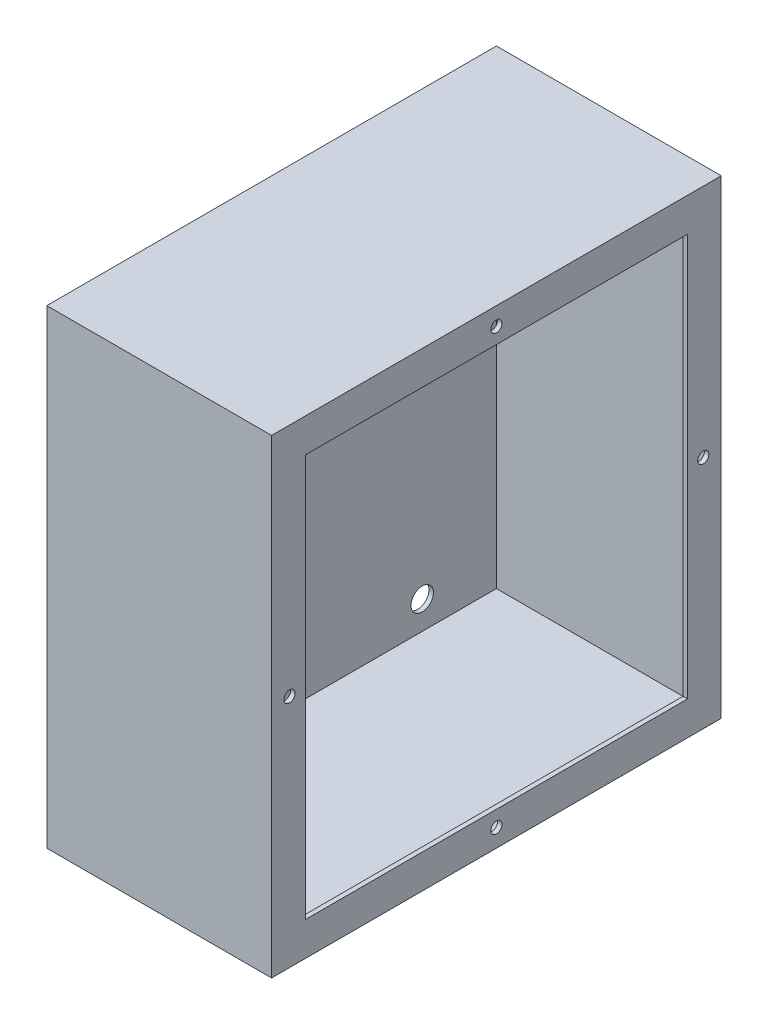
ISO-10303-21;
HEADER;
FILE_DESCRIPTION(('STEP AP214'),'2;1');
FILE_NAME('part.step','',(''),(''),'','','');
FILE_SCHEMA(('AUTOMOTIVE_DESIGN { 1 0 10303 214 1 1 1 1 }'));
ENDSEC;
DATA;
#1=APPLICATION_CONTEXT('core data for automotive mechanical design processes');
#2=APPLICATION_PROTOCOL_DEFINITION('international standard','automotive_design',2000,#1);
#3=PRODUCT_CONTEXT('',#1,'mechanical');
#4=PRODUCT('Part','Part','',(#3));
#5=PRODUCT_RELATED_PRODUCT_CATEGORY('part','',(#4));
#6=PRODUCT_DEFINITION_FORMATION('','',#4);
#7=PRODUCT_DEFINITION_CONTEXT('part definition',#1,'design');
#8=PRODUCT_DEFINITION('design','',#6,#7);
#9=PRODUCT_DEFINITION_SHAPE('','',#8);
#10=(LENGTH_UNIT() NAMED_UNIT(*) SI_UNIT(.MILLI.,.METRE.));
#11=(NAMED_UNIT(*) PLANE_ANGLE_UNIT() SI_UNIT($,.RADIAN.));
#12=(NAMED_UNIT(*) SI_UNIT($,.STERADIAN.) SOLID_ANGLE_UNIT());
#13=UNCERTAINTY_MEASURE_WITH_UNIT(LENGTH_MEASURE(1.E-05),#10,'distance_accuracy_value','');
#14=(GEOMETRIC_REPRESENTATION_CONTEXT(3) GLOBAL_UNCERTAINTY_ASSIGNED_CONTEXT((#13)) GLOBAL_UNIT_ASSIGNED_CONTEXT((#10,
#11,#12)) REPRESENTATION_CONTEXT('',''));
#15=CARTESIAN_POINT('',(0.,0.,0.));
#16=DIRECTION('',(0.,0.,1.));
#17=DIRECTION('',(1.,0.,0.));
#18=AXIS2_PLACEMENT_3D('',#15,#16,#17);
#19=CARTESIAN_POINT('',(100.,104.5,-100.));
#20=DIRECTION('',(0.,0.,1.));
#21=DIRECTION('',(0.,-1.,0.));
#22=AXIS2_PLACEMENT_3D('',#19,#20,#21);
#23=PLANE('',#22);
#24=DIRECTION('',(0.,1.,0.));
#25=VECTOR('',#24,1.);
#26=CARTESIAN_POINT('',(0.,104.5,-100.));
#27=LINE('',#26,#25);
#28=CARTESIAN_POINT('',(0.,-104.5,-100.));
#29=VERTEX_POINT('',#28);
#30=CARTESIAN_POINT('',(0.,104.5,-100.));
#31=VERTEX_POINT('',#30);
#32=EDGE_CURVE('E162',#29,#31,#27,.T.);
#33=ORIENTED_EDGE('',*,*,#32,.T.);
#34=DIRECTION('',(-1.,0.,0.));
#35=VECTOR('',#34,1.);
#36=CARTESIAN_POINT('',(100.,104.5,-100.));
#37=LINE('',#36,#35);
#38=CARTESIAN_POINT('',(100.,104.5,-100.));
#39=VERTEX_POINT('',#38);
#40=EDGE_CURVE('E178',#39,#31,#37,.T.);
#41=ORIENTED_EDGE('',*,*,#40,.F.);
#42=DIRECTION('',(0.,1.,0.));
#43=VECTOR('',#42,1.);
#44=CARTESIAN_POINT('',(100.,104.5,-100.));
#45=LINE('',#44,#43);
#46=CARTESIAN_POINT('',(100.,-104.5,-100.));
#47=VERTEX_POINT('',#46);
#48=EDGE_CURVE('E151',#47,#39,#45,.T.);
#49=ORIENTED_EDGE('',*,*,#48,.F.);
#50=DIRECTION('',(-1.,0.,0.));
#51=VECTOR('',#50,1.);
#52=CARTESIAN_POINT('',(100.,-104.5,-100.));
#53=LINE('',#52,#51);
#54=EDGE_CURVE('E161',#47,#29,#53,.T.);
#55=ORIENTED_EDGE('',*,*,#54,.T.);
#56=EDGE_LOOP('',(#33,#41,#49,#55));
#57=FACE_BOUND('',#56,.T.);
#58=ADVANCED_FACE('F35',(#57),#23,.F.);
#59=CARTESIAN_POINT('',(100.,104.5,100.));
#60=DIRECTION('',(0.,-1.,0.));
#61=DIRECTION('',(0.,0.,-1.));
#62=AXIS2_PLACEMENT_3D('',#59,#60,#61);
#63=PLANE('',#62);
#64=DIRECTION('',(0.,0.,1.));
#65=VECTOR('',#64,1.);
#66=CARTESIAN_POINT('',(0.,104.5,100.));
#67=LINE('',#66,#65);
#68=CARTESIAN_POINT('',(0.,104.5,100.));
#69=VERTEX_POINT('',#68);
#70=EDGE_CURVE('E165',#31,#69,#67,.T.);
#71=ORIENTED_EDGE('',*,*,#70,.T.);
#72=DIRECTION('',(-1.,0.,0.));
#73=VECTOR('',#72,1.);
#74=CARTESIAN_POINT('',(100.,104.5,100.));
#75=LINE('',#74,#73);
#76=CARTESIAN_POINT('',(100.,104.5,100.));
#77=VERTEX_POINT('',#76);
#78=EDGE_CURVE('E175',#77,#69,#75,.T.);
#79=ORIENTED_EDGE('',*,*,#78,.F.);
#80=DIRECTION('',(0.,0.,1.));
#81=VECTOR('',#80,1.);
#82=CARTESIAN_POINT('',(100.,104.5,100.));
#83=LINE('',#82,#81);
#84=EDGE_CURVE('E154',#39,#77,#83,.T.);
#85=ORIENTED_EDGE('',*,*,#84,.F.);
#86=ORIENTED_EDGE('',*,*,#40,.T.);
#87=EDGE_LOOP('',(#71,#79,#85,#86));
#88=FACE_BOUND('',#87,.T.);
#89=ADVANCED_FACE('F233',(#88),#63,.F.);
#90=CARTESIAN_POINT('',(100.,104.5,100.));
#91=DIRECTION('',(0.,0.,-1.));
#92=DIRECTION('',(0.,1.,0.));
#93=AXIS2_PLACEMENT_3D('',#90,#91,#92);
#94=PLANE('',#93);
#95=DIRECTION('',(0.,-1.,0.));
#96=VECTOR('',#95,1.);
#97=CARTESIAN_POINT('',(0.,104.5,100.));
#98=LINE('',#97,#96);
#99=CARTESIAN_POINT('',(0.,-104.5,100.));
#100=VERTEX_POINT('',#99);
#101=EDGE_CURVE('E167',#69,#100,#98,.T.);
#102=ORIENTED_EDGE('',*,*,#101,.T.);
#103=DIRECTION('',(-1.,0.,0.));
#104=VECTOR('',#103,1.);
#105=CARTESIAN_POINT('',(100.,-104.5,100.));
#106=LINE('',#105,#104);
#107=CARTESIAN_POINT('',(100.,-104.5,100.));
#108=VERTEX_POINT('',#107);
#109=EDGE_CURVE('E172',#108,#100,#106,.T.);
#110=ORIENTED_EDGE('',*,*,#109,.F.);
#111=DIRECTION('',(0.,-1.,0.));
#112=VECTOR('',#111,1.);
#113=CARTESIAN_POINT('',(100.,104.5,100.));
#114=LINE('',#113,#112);
#115=EDGE_CURVE('E157',#77,#108,#114,.T.);
#116=ORIENTED_EDGE('',*,*,#115,.F.);
#117=ORIENTED_EDGE('',*,*,#78,.T.);
#118=EDGE_LOOP('',(#102,#110,#116,#117));
#119=FACE_BOUND('',#118,.T.);
#120=ADVANCED_FACE('F239',(#119),#94,.F.);
#121=CARTESIAN_POINT('',(100.,-104.5,100.));
#122=DIRECTION('',(0.,1.,0.));
#123=DIRECTION('',(0.,0.,1.));
#124=AXIS2_PLACEMENT_3D('',#121,#122,#123);
#125=PLANE('',#124);
#126=DIRECTION('',(0.,0.,-1.));
#127=VECTOR('',#126,1.);
#128=CARTESIAN_POINT('',(0.,-104.5,100.));
#129=LINE('',#128,#127);
#130=EDGE_CURVE('E155',#100,#29,#129,.T.);
#131=ORIENTED_EDGE('',*,*,#130,.T.);
#132=ORIENTED_EDGE('',*,*,#54,.F.);
#133=DIRECTION('',(0.,0.,-1.));
#134=VECTOR('',#133,1.);
#135=CARTESIAN_POINT('',(100.,-104.5,100.));
#136=LINE('',#135,#134);
#137=EDGE_CURVE('E159',#108,#47,#136,.T.);
#138=ORIENTED_EDGE('',*,*,#137,.F.);
#139=ORIENTED_EDGE('',*,*,#109,.T.);
#140=EDGE_LOOP('',(#131,#132,#138,#139));
#141=FACE_BOUND('',#140,.T.);
#142=ADVANCED_FACE('F311',(#141),#125,.F.);
#143=CARTESIAN_POINT('',(100.,0.,0.));
#144=DIRECTION('',(1.,0.,0.));
#145=DIRECTION('',(0.,0.,-1.));
#146=AXIS2_PLACEMENT_3D('',#143,#144,#145);
#147=PLANE('',#146);
#148=CARTESIAN_POINT('',(100.,96.5,0.));
#149=DIRECTION('',(1.,0.,0.));
#150=DIRECTION('',(0.,0.,-1.));
#151=AXIS2_PLACEMENT_3D('',#148,#149,#150);
#152=CIRCLE('',#151,2.5);
#153=CARTESIAN_POINT('',(100.,96.5,-2.5));
#154=VERTEX_POINT('',#153);
#155=EDGE_CURVE('E485',#154,#154,#152,.T.);
#156=ORIENTED_EDGE('',*,*,#155,.F.);
#157=EDGE_LOOP('',(#156));
#158=FACE_BOUND('',#157,.T.);
#159=CARTESIAN_POINT('',(100.,0.,92.));
#160=DIRECTION('',(1.,0.,0.));
#161=DIRECTION('',(0.,0.,-1.));
#162=AXIS2_PLACEMENT_3D('',#159,#160,#161);
#163=CIRCLE('',#162,2.49999999999999);
#164=CARTESIAN_POINT('',(100.,0.,89.5));
#165=VERTEX_POINT('',#164);
#166=EDGE_CURVE('E492',#165,#165,#163,.T.);
#167=ORIENTED_EDGE('',*,*,#166,.F.);
#168=EDGE_LOOP('',(#167));
#169=FACE_BOUND('',#168,.T.);
#170=CARTESIAN_POINT('',(100.,-96.5,0.));
#171=DIRECTION('',(1.,0.,0.));
#172=DIRECTION('',(0.,0.,1.));
#173=AXIS2_PLACEMENT_3D('',#170,#171,#172);
#174=CIRCLE('',#173,2.5);
#175=CARTESIAN_POINT('',(100.,-96.5,2.5));
#176=VERTEX_POINT('',#175);
#177=EDGE_CURVE('E498',#176,#176,#174,.T.);
#178=ORIENTED_EDGE('',*,*,#177,.F.);
#179=EDGE_LOOP('',(#178));
#180=FACE_BOUND('',#179,.T.);
#181=CARTESIAN_POINT('',(100.,0.,-92.));
#182=DIRECTION('',(1.,0.,0.));
#183=DIRECTION('',(0.,0.,1.));
#184=AXIS2_PLACEMENT_3D('',#181,#182,#183);
#185=CIRCLE('',#184,2.49999999999999);
#186=CARTESIAN_POINT('',(100.,0.,-89.5));
#187=VERTEX_POINT('',#186);
#188=EDGE_CURVE('E483',#187,#187,#185,.T.);
#189=ORIENTED_EDGE('',*,*,#188,.F.);
#190=EDGE_LOOP('',(#189));
#191=FACE_BOUND('',#190,.T.);
#192=DIRECTION('',(0.,1.,0.));
#193=VECTOR('',#192,1.);
#194=CARTESIAN_POINT('',(100.,89.5,-85.));
#195=LINE('',#194,#193);
#196=CARTESIAN_POINT('',(100.,-89.5,-85.));
#197=VERTEX_POINT('',#196);
#198=CARTESIAN_POINT('',(100.,89.5,-85.));
#199=VERTEX_POINT('',#198);
#200=EDGE_CURVE('E60',#197,#199,#195,.T.);
#201=ORIENTED_EDGE('',*,*,#200,.F.);
#202=DIRECTION('',(0.,0.,-1.));
#203=VECTOR('',#202,1.);
#204=CARTESIAN_POINT('',(100.,-89.5,85.));
#205=LINE('',#204,#203);
#206=CARTESIAN_POINT('',(100.,-89.5,85.));
#207=VERTEX_POINT('',#206);
#208=EDGE_CURVE('E127',#207,#197,#205,.T.);
#209=ORIENTED_EDGE('',*,*,#208,.F.);
#210=DIRECTION('',(0.,-1.,0.));
#211=VECTOR('',#210,1.);
#212=CARTESIAN_POINT('',(100.,89.5,85.));
#213=LINE('',#212,#211);
#214=CARTESIAN_POINT('',(100.,89.5,85.));
#215=VERTEX_POINT('',#214);
#216=EDGE_CURVE('E510',#215,#207,#213,.T.);
#217=ORIENTED_EDGE('',*,*,#216,.F.);
#218=DIRECTION('',(0.,0.,1.));
#219=VECTOR('',#218,1.);
#220=CARTESIAN_POINT('',(100.,89.5,85.));
#221=LINE('',#220,#219);
#222=EDGE_CURVE('E513',#199,#215,#221,.T.);
#223=ORIENTED_EDGE('',*,*,#222,.F.);
#224=EDGE_LOOP('',(#201,#209,#217,#223));
#225=FACE_BOUND('',#224,.T.);
#226=ORIENTED_EDGE('',*,*,#48,.T.);
#227=ORIENTED_EDGE('',*,*,#84,.T.);
#228=ORIENTED_EDGE('',*,*,#115,.T.);
#229=ORIENTED_EDGE('',*,*,#137,.T.);
#230=EDGE_LOOP('',(#226,#227,#228,#229));
#231=FACE_BOUND('',#230,.T.);
#232=ADVANCED_FACE('F306',(#158,#169,#180,#191,#225,#231),#147,.T.);
#233=CARTESIAN_POINT('',(0.,0.,0.));
#234=DIRECTION('',(1.,0.,0.));
#235=DIRECTION('',(0.,0.,-1.));
#236=AXIS2_PLACEMENT_3D('',#233,#234,#235);
#237=PLANE('',#236);
#238=CARTESIAN_POINT('',(0.,90.,65.));
#239=DIRECTION('',(-1.,0.,0.));
#240=DIRECTION('',(0.,0.,-1.));
#241=AXIS2_PLACEMENT_3D('',#238,#239,#240);
#242=CIRCLE('',#241,5.);
#243=CARTESIAN_POINT('',(0.,90.,60.));
#244=VERTEX_POINT('',#243);
#245=EDGE_CURVE('E464',#244,#244,#242,.T.);
#246=ORIENTED_EDGE('',*,*,#245,.F.);
#247=EDGE_LOOP('',(#246));
#248=FACE_BOUND('',#247,.T.);
#249=CARTESIAN_POINT('',(0.,-90.0000000000001,-64.9999999999999));
#250=DIRECTION('',(-1.,0.,0.));
#251=DIRECTION('',(0.,0.,-1.));
#252=AXIS2_PLACEMENT_3D('',#249,#250,#251);
#253=CIRCLE('',#252,4.99999999999999);
#254=CARTESIAN_POINT('',(0.,-90.0000000000001,-69.9999999999999));
#255=VERTEX_POINT('',#254);
#256=EDGE_CURVE('E470',#255,#255,#253,.T.);
#257=ORIENTED_EDGE('',*,*,#256,.F.);
#258=EDGE_LOOP('',(#257));
#259=FACE_BOUND('',#258,.T.);
#260=CARTESIAN_POINT('',(0.,-89.9999999999999,65.0000000000001));
#261=DIRECTION('',(-1.,0.,0.));
#262=DIRECTION('',(0.,0.,1.));
#263=AXIS2_PLACEMENT_3D('',#260,#261,#262);
#264=CIRCLE('',#263,5.00000000000001);
#265=CARTESIAN_POINT('',(0.,-89.9999999999999,70.0000000000001));
#266=VERTEX_POINT('',#265);
#267=EDGE_CURVE('E481',#266,#266,#264,.T.);
#268=ORIENTED_EDGE('',*,*,#267,.F.);
#269=EDGE_LOOP('',(#268));
#270=FACE_BOUND('',#269,.T.);
#271=CARTESIAN_POINT('',(0.,90.,-65.));
#272=DIRECTION('',(-1.,0.,0.));
#273=DIRECTION('',(0.,0.,1.));
#274=AXIS2_PLACEMENT_3D('',#271,#272,#273);
#275=CIRCLE('',#274,5.);
#276=CARTESIAN_POINT('',(0.,90.,-60.));
#277=VERTEX_POINT('',#276);
#278=EDGE_CURVE('E468',#277,#277,#275,.T.);
#279=ORIENTED_EDGE('',*,*,#278,.F.);
#280=EDGE_LOOP('',(#279));
#281=FACE_BOUND('',#280,.T.);
#282=ORIENTED_EDGE('',*,*,#32,.F.);
#283=ORIENTED_EDGE('',*,*,#130,.F.);
#284=ORIENTED_EDGE('',*,*,#101,.F.);
#285=ORIENTED_EDGE('',*,*,#70,.F.);
#286=EDGE_LOOP('',(#282,#283,#284,#285));
#287=FACE_BOUND('',#286,.T.);
#288=ADVANCED_FACE('F270',(#248,#259,#270,#281,#287),#237,.F.);
#289=CARTESIAN_POINT('',(-0.001000000000001,89.5,-85.));
#290=DIRECTION('',(0.,0.,-1.));
#291=DIRECTION('',(0.,1.,0.));
#292=AXIS2_PLACEMENT_3D('',#289,#290,#291);
#293=PLANE('',#292);
#294=DIRECTION('',(0.,-1.,0.));
#295=VECTOR('',#294,1.);
#296=CARTESIAN_POINT('',(98.,89.5,-85.));
#297=LINE('',#296,#295);
#298=CARTESIAN_POINT('',(98.,89.5,-85.));
#299=VERTEX_POINT('',#298);
#300=CARTESIAN_POINT('',(98.,-89.5,-85.));
#301=VERTEX_POINT('',#300);
#302=EDGE_CURVE('E132',#299,#301,#297,.T.);
#303=ORIENTED_EDGE('',*,*,#302,.T.);
#304=DIRECTION('',(1.,0.,0.));
#305=VECTOR('',#304,1.);
#306=CARTESIAN_POINT('',(-0.001000000000001,-89.5,-85.));
#307=LINE('',#306,#305);
#308=EDGE_CURVE('E123',#301,#197,#307,.T.);
#309=ORIENTED_EDGE('',*,*,#308,.T.);
#310=ORIENTED_EDGE('',*,*,#200,.T.);
#311=DIRECTION('',(1.,0.,0.));
#312=VECTOR('',#311,1.);
#313=CARTESIAN_POINT('',(-0.001000000000001,89.5,-85.));
#314=LINE('',#313,#312);
#315=EDGE_CURVE('E129',#299,#199,#314,.T.);
#316=ORIENTED_EDGE('',*,*,#315,.F.);
#317=EDGE_LOOP('',(#303,#309,#310,#316));
#318=FACE_BOUND('',#317,.T.);
#319=ADVANCED_FACE('F133',(#318),#293,.F.);
#320=CARTESIAN_POINT('',(-0.001000000000001,-89.5,85.));
#321=DIRECTION('',(0.,-1.,0.));
#322=DIRECTION('',(0.,0.,-1.));
#323=AXIS2_PLACEMENT_3D('',#320,#321,#322);
#324=PLANE('',#323);
#325=DIRECTION('',(0.,0.,1.));
#326=VECTOR('',#325,1.);
#327=CARTESIAN_POINT('',(98.,-89.5,85.));
#328=LINE('',#327,#326);
#329=CARTESIAN_POINT('',(98.,-89.5,85.));
#330=VERTEX_POINT('',#329);
#331=EDGE_CURVE('E52',#301,#330,#328,.T.);
#332=ORIENTED_EDGE('',*,*,#331,.T.);
#333=DIRECTION('',(1.,0.,0.));
#334=VECTOR('',#333,1.);
#335=CARTESIAN_POINT('',(-0.001000000000001,-89.5,85.));
#336=LINE('',#335,#334);
#337=EDGE_CURVE('E128',#330,#207,#336,.T.);
#338=ORIENTED_EDGE('',*,*,#337,.T.);
#339=ORIENTED_EDGE('',*,*,#208,.T.);
#340=ORIENTED_EDGE('',*,*,#308,.F.);
#341=EDGE_LOOP('',(#332,#338,#339,#340));
#342=FACE_BOUND('',#341,.T.);
#343=ADVANCED_FACE('F125',(#342),#324,.F.);
#344=CARTESIAN_POINT('',(-0.001000000000001,89.5,85.));
#345=DIRECTION('',(0.,0.,1.));
#346=DIRECTION('',(0.,-1.,0.));
#347=AXIS2_PLACEMENT_3D('',#344,#345,#346);
#348=PLANE('',#347);
#349=DIRECTION('',(0.,1.,0.));
#350=VECTOR('',#349,1.);
#351=CARTESIAN_POINT('',(98.,89.5,85.));
#352=LINE('',#351,#350);
#353=CARTESIAN_POINT('',(98.,89.5,85.));
#354=VERTEX_POINT('',#353);
#355=EDGE_CURVE('E142',#330,#354,#352,.T.);
#356=ORIENTED_EDGE('',*,*,#355,.T.);
#357=DIRECTION('',(1.,0.,0.));
#358=VECTOR('',#357,1.);
#359=CARTESIAN_POINT('',(-0.001000000000001,89.5,85.));
#360=LINE('',#359,#358);
#361=EDGE_CURVE('E148',#354,#215,#360,.T.);
#362=ORIENTED_EDGE('',*,*,#361,.T.);
#363=ORIENTED_EDGE('',*,*,#216,.T.);
#364=ORIENTED_EDGE('',*,*,#337,.F.);
#365=EDGE_LOOP('',(#356,#362,#363,#364));
#366=FACE_BOUND('',#365,.T.);
#367=ADVANCED_FACE('F281',(#366),#348,.F.);
#368=CARTESIAN_POINT('',(-0.001000000000001,89.5,85.));
#369=DIRECTION('',(0.,1.,0.));
#370=DIRECTION('',(0.,0.,1.));
#371=AXIS2_PLACEMENT_3D('',#368,#369,#370);
#372=PLANE('',#371);
#373=DIRECTION('',(0.,0.,-1.));
#374=VECTOR('',#373,1.);
#375=CARTESIAN_POINT('',(98.,89.5,85.));
#376=LINE('',#375,#374);
#377=EDGE_CURVE('E137',#354,#299,#376,.T.);
#378=ORIENTED_EDGE('',*,*,#377,.T.);
#379=ORIENTED_EDGE('',*,*,#315,.T.);
#380=ORIENTED_EDGE('',*,*,#222,.T.);
#381=ORIENTED_EDGE('',*,*,#361,.F.);
#382=EDGE_LOOP('',(#378,#379,#380,#381));
#383=FACE_BOUND('',#382,.T.);
#384=ADVANCED_FACE('F290',(#383),#372,.F.);
#385=CARTESIAN_POINT('',(98.,0.,0.));
#386=DIRECTION('',(1.,0.,0.));
#387=DIRECTION('',(0.,0.,-1.));
#388=AXIS2_PLACEMENT_3D('',#385,#386,#387);
#389=PLANE('',#388);
#390=CARTESIAN_POINT('',(98.,96.5,0.));
#391=DIRECTION('',(1.,0.,0.));
#392=DIRECTION('',(0.,0.,-1.));
#393=AXIS2_PLACEMENT_3D('',#390,#391,#392);
#394=CIRCLE('',#393,2.5);
#395=CARTESIAN_POINT('',(98.,96.5,-2.5));
#396=VERTEX_POINT('',#395);
#397=EDGE_CURVE('E488',#396,#396,#394,.F.);
#398=ORIENTED_EDGE('',*,*,#397,.F.);
#399=EDGE_LOOP('',(#398));
#400=FACE_BOUND('',#399,.T.);
#401=CARTESIAN_POINT('',(98.,0.,92.));
#402=DIRECTION('',(1.,0.,0.));
#403=DIRECTION('',(0.,0.,-1.));
#404=AXIS2_PLACEMENT_3D('',#401,#402,#403);
#405=CIRCLE('',#404,2.49999999999999);
#406=CARTESIAN_POINT('',(98.,0.,89.5));
#407=VERTEX_POINT('',#406);
#408=EDGE_CURVE('E489',#407,#407,#405,.F.);
#409=ORIENTED_EDGE('',*,*,#408,.F.);
#410=EDGE_LOOP('',(#409));
#411=FACE_BOUND('',#410,.T.);
#412=CARTESIAN_POINT('',(98.,-96.5,0.));
#413=DIRECTION('',(1.,0.,0.));
#414=DIRECTION('',(0.,0.,-1.));
#415=AXIS2_PLACEMENT_3D('',#412,#413,#414);
#416=CIRCLE('',#415,2.5);
#417=CARTESIAN_POINT('',(98.,-96.5,-2.5));
#418=VERTEX_POINT('',#417);
#419=EDGE_CURVE('E495',#418,#418,#416,.F.);
#420=ORIENTED_EDGE('',*,*,#419,.F.);
#421=EDGE_LOOP('',(#420));
#422=FACE_BOUND('',#421,.T.);
#423=CARTESIAN_POINT('',(98.,0.,-92.));
#424=DIRECTION('',(1.,0.,0.));
#425=DIRECTION('',(0.,0.,-1.));
#426=AXIS2_PLACEMENT_3D('',#423,#424,#425);
#427=CIRCLE('',#426,2.49999999999999);
#428=CARTESIAN_POINT('',(98.,0.,-94.5));
#429=VERTEX_POINT('',#428);
#430=EDGE_CURVE('E501',#429,#429,#427,.F.);
#431=ORIENTED_EDGE('',*,*,#430,.F.);
#432=EDGE_LOOP('',(#431));
#433=FACE_BOUND('',#432,.T.);
#434=DIRECTION('',(0.,1.,0.));
#435=VECTOR('',#434,1.);
#436=CARTESIAN_POINT('',(98.,104.5,-98.));
#437=LINE('',#436,#435);
#438=CARTESIAN_POINT('',(98.,-102.5,-98.));
#439=VERTEX_POINT('',#438);
#440=CARTESIAN_POINT('',(98.,102.5,-98.));
#441=VERTEX_POINT('',#440);
#442=EDGE_CURVE('E184',#439,#441,#437,.T.);
#443=ORIENTED_EDGE('',*,*,#442,.F.);
#444=DIRECTION('',(0.,0.,-1.));
#445=VECTOR('',#444,1.);
#446=CARTESIAN_POINT('',(98.,-102.5,100.));
#447=LINE('',#446,#445);
#448=CARTESIAN_POINT('',(98.,-102.5,98.));
#449=VERTEX_POINT('',#448);
#450=EDGE_CURVE('E11',#449,#439,#447,.T.);
#451=ORIENTED_EDGE('',*,*,#450,.F.);
#452=DIRECTION('',(0.,-1.,0.));
#453=VECTOR('',#452,1.);
#454=CARTESIAN_POINT('',(98.,104.5,98.));
#455=LINE('',#454,#453);
#456=CARTESIAN_POINT('',(98.,102.5,98.));
#457=VERTEX_POINT('',#456);
#458=EDGE_CURVE('E44',#457,#449,#455,.T.);
#459=ORIENTED_EDGE('',*,*,#458,.F.);
#460=DIRECTION('',(0.,0.,1.));
#461=VECTOR('',#460,1.);
#462=CARTESIAN_POINT('',(98.,102.5,100.));
#463=LINE('',#462,#461);
#464=EDGE_CURVE('E182',#441,#457,#463,.T.);
#465=ORIENTED_EDGE('',*,*,#464,.F.);
#466=EDGE_LOOP('',(#443,#451,#459,#465));
#467=FACE_BOUND('',#466,.T.);
#468=ORIENTED_EDGE('',*,*,#377,.F.);
#469=ORIENTED_EDGE('',*,*,#355,.F.);
#470=ORIENTED_EDGE('',*,*,#331,.F.);
#471=ORIENTED_EDGE('',*,*,#302,.F.);
#472=EDGE_LOOP('',(#468,#469,#470,#471));
#473=FACE_BOUND('',#472,.T.);
#474=ADVANCED_FACE('F140',(#400,#411,#422,#433,#467,#473),#389,.F.);
#475=CARTESIAN_POINT('',(100.,104.5,-98.));
#476=DIRECTION('',(0.,0.,1.));
#477=DIRECTION('',(0.,-1.,0.));
#478=AXIS2_PLACEMENT_3D('',#475,#476,#477);
#479=PLANE('',#478);
#480=DIRECTION('',(0.,1.,0.));
#481=VECTOR('',#480,1.);
#482=CARTESIAN_POINT('',(2.,104.5,-98.));
#483=LINE('',#482,#481);
#484=CARTESIAN_POINT('',(2.,-102.5,-98.));
#485=VERTEX_POINT('',#484);
#486=CARTESIAN_POINT('',(2.,102.5,-98.));
#487=VERTEX_POINT('',#486);
#488=EDGE_CURVE('E39',#485,#487,#483,.T.);
#489=ORIENTED_EDGE('',*,*,#488,.F.);
#490=DIRECTION('',(-1.,0.,0.));
#491=VECTOR('',#490,1.);
#492=CARTESIAN_POINT('',(100.,-102.5,-98.));
#493=LINE('',#492,#491);
#494=EDGE_CURVE('E201',#439,#485,#493,.T.);
#495=ORIENTED_EDGE('',*,*,#494,.F.);
#496=ORIENTED_EDGE('',*,*,#442,.T.);
#497=DIRECTION('',(-1.,0.,0.));
#498=VECTOR('',#497,1.);
#499=CARTESIAN_POINT('',(100.,102.5,-98.));
#500=LINE('',#499,#498);
#501=EDGE_CURVE('E197',#441,#487,#500,.T.);
#502=ORIENTED_EDGE('',*,*,#501,.T.);
#503=EDGE_LOOP('',(#489,#495,#496,#502));
#504=FACE_BOUND('',#503,.T.);
#505=ADVANCED_FACE('F210',(#504),#479,.T.);
#506=CARTESIAN_POINT('',(100.,102.5,100.));
#507=DIRECTION('',(0.,-1.,0.));
#508=DIRECTION('',(0.,0.,-1.));
#509=AXIS2_PLACEMENT_3D('',#506,#507,#508);
#510=PLANE('',#509);
#511=DIRECTION('',(0.,0.,1.));
#512=VECTOR('',#511,1.);
#513=CARTESIAN_POINT('',(2.,102.5,100.));
#514=LINE('',#513,#512);
#515=CARTESIAN_POINT('',(2.,102.5,98.));
#516=VERTEX_POINT('',#515);
#517=EDGE_CURVE('E200',#487,#516,#514,.T.);
#518=ORIENTED_EDGE('',*,*,#517,.F.);
#519=ORIENTED_EDGE('',*,*,#501,.F.);
#520=ORIENTED_EDGE('',*,*,#464,.T.);
#521=DIRECTION('',(-1.,0.,0.));
#522=VECTOR('',#521,1.);
#523=CARTESIAN_POINT('',(100.,102.5,98.));
#524=LINE('',#523,#522);
#525=EDGE_CURVE('E192',#457,#516,#524,.T.);
#526=ORIENTED_EDGE('',*,*,#525,.T.);
#527=EDGE_LOOP('',(#518,#519,#520,#526));
#528=FACE_BOUND('',#527,.T.);
#529=ADVANCED_FACE('F214',(#528),#510,.T.);
#530=CARTESIAN_POINT('',(100.,104.5,98.));
#531=DIRECTION('',(0.,0.,-1.));
#532=DIRECTION('',(0.,1.,0.));
#533=AXIS2_PLACEMENT_3D('',#530,#531,#532);
#534=PLANE('',#533);
#535=DIRECTION('',(0.,-1.,0.));
#536=VECTOR('',#535,1.);
#537=CARTESIAN_POINT('',(2.,104.5,98.));
#538=LINE('',#537,#536);
#539=CARTESIAN_POINT('',(2.,-102.5,98.));
#540=VERTEX_POINT('',#539);
#541=EDGE_CURVE('E195',#516,#540,#538,.T.);
#542=ORIENTED_EDGE('',*,*,#541,.F.);
#543=ORIENTED_EDGE('',*,*,#525,.F.);
#544=ORIENTED_EDGE('',*,*,#458,.T.);
#545=DIRECTION('',(-1.,0.,0.));
#546=VECTOR('',#545,1.);
#547=CARTESIAN_POINT('',(100.,-102.5,98.));
#548=LINE('',#547,#546);
#549=EDGE_CURVE('E187',#449,#540,#548,.T.);
#550=ORIENTED_EDGE('',*,*,#549,.T.);
#551=EDGE_LOOP('',(#542,#543,#544,#550));
#552=FACE_BOUND('',#551,.T.);
#553=ADVANCED_FACE('F219',(#552),#534,.T.);
#554=CARTESIAN_POINT('',(100.,-102.5,100.));
#555=DIRECTION('',(0.,1.,0.));
#556=DIRECTION('',(0.,0.,1.));
#557=AXIS2_PLACEMENT_3D('',#554,#555,#556);
#558=PLANE('',#557);
#559=DIRECTION('',(0.,0.,-1.));
#560=VECTOR('',#559,1.);
#561=CARTESIAN_POINT('',(2.,-102.5,100.));
#562=LINE('',#561,#560);
#563=EDGE_CURVE('E190',#540,#485,#562,.T.);
#564=ORIENTED_EDGE('',*,*,#563,.F.);
#565=ORIENTED_EDGE('',*,*,#549,.F.);
#566=ORIENTED_EDGE('',*,*,#450,.T.);
#567=ORIENTED_EDGE('',*,*,#494,.T.);
#568=EDGE_LOOP('',(#564,#565,#566,#567));
#569=FACE_BOUND('',#568,.T.);
#570=ADVANCED_FACE('F222',(#569),#558,.T.);
#571=CARTESIAN_POINT('',(2.,0.,0.));
#572=DIRECTION('',(1.,0.,0.));
#573=DIRECTION('',(0.,0.,-1.));
#574=AXIS2_PLACEMENT_3D('',#571,#572,#573);
#575=PLANE('',#574);
#576=CARTESIAN_POINT('',(2.,90.,65.));
#577=DIRECTION('',(1.,0.,0.));
#578=DIRECTION('',(0.,0.,-1.));
#579=AXIS2_PLACEMENT_3D('',#576,#577,#578);
#580=CIRCLE('',#579,5.);
#581=CARTESIAN_POINT('',(2.,90.,60.));
#582=VERTEX_POINT('',#581);
#583=EDGE_CURVE('E461',#582,#582,#580,.F.);
#584=ORIENTED_EDGE('',*,*,#583,.T.);
#585=EDGE_LOOP('',(#584));
#586=FACE_BOUND('',#585,.T.);
#587=CARTESIAN_POINT('',(2.,-90.0000000000001,-64.9999999999999));
#588=DIRECTION('',(1.,0.,0.));
#589=DIRECTION('',(0.,0.,-1.));
#590=AXIS2_PLACEMENT_3D('',#587,#588,#589);
#591=CIRCLE('',#590,4.99999999999999);
#592=CARTESIAN_POINT('',(2.,-90.0000000000001,-69.9999999999999));
#593=VERTEX_POINT('',#592);
#594=EDGE_CURVE('E478',#593,#593,#591,.F.);
#595=ORIENTED_EDGE('',*,*,#594,.T.);
#596=EDGE_LOOP('',(#595));
#597=FACE_BOUND('',#596,.T.);
#598=CARTESIAN_POINT('',(2.,-89.9999999999999,65.0000000000001));
#599=DIRECTION('',(1.,0.,0.));
#600=DIRECTION('',(0.,0.,-1.));
#601=AXIS2_PLACEMENT_3D('',#598,#599,#600);
#602=CIRCLE('',#601,5.00000000000001);
#603=CARTESIAN_POINT('',(2.,-89.9999999999999,60.0000000000001));
#604=VERTEX_POINT('',#603);
#605=EDGE_CURVE('E473',#604,#604,#602,.F.);
#606=ORIENTED_EDGE('',*,*,#605,.T.);
#607=EDGE_LOOP('',(#606));
#608=FACE_BOUND('',#607,.T.);
#609=CARTESIAN_POINT('',(2.,90.,-65.));
#610=DIRECTION('',(1.,0.,0.));
#611=DIRECTION('',(0.,0.,-1.));
#612=AXIS2_PLACEMENT_3D('',#609,#610,#611);
#613=CIRCLE('',#612,5.);
#614=CARTESIAN_POINT('',(2.,90.,-70.));
#615=VERTEX_POINT('',#614);
#616=EDGE_CURVE('E465',#615,#615,#613,.F.);
#617=ORIENTED_EDGE('',*,*,#616,.T.);
#618=EDGE_LOOP('',(#617));
#619=FACE_BOUND('',#618,.T.);
#620=ORIENTED_EDGE('',*,*,#488,.T.);
#621=ORIENTED_EDGE('',*,*,#517,.T.);
#622=ORIENTED_EDGE('',*,*,#541,.T.);
#623=ORIENTED_EDGE('',*,*,#563,.T.);
#624=EDGE_LOOP('',(#620,#621,#622,#623));
#625=FACE_BOUND('',#624,.T.);
#626=ADVANCED_FACE('F37',(#586,#597,#608,#619,#625),#575,.T.);
#627=CARTESIAN_POINT('',(-0.001000000000001,0.,-92.));
#628=DIRECTION('',(1.,0.,0.));
#629=DIRECTION('',(0.,0.,-1.));
#630=AXIS2_PLACEMENT_3D('',#627,#628,#629);
#631=CYLINDRICAL_SURFACE('',#630,2.49999999999999);
#632=ORIENTED_EDGE('',*,*,#188,.T.);
#633=EDGE_LOOP('',(#632));
#634=FACE_BOUND('',#633,.T.);
#635=ORIENTED_EDGE('',*,*,#430,.T.);
#636=EDGE_LOOP('',(#635));
#637=FACE_BOUND('',#636,.T.);
#638=ADVANCED_FACE('F229',(#634,#637),#631,.F.);
#639=CARTESIAN_POINT('',(-0.001000000000001,-96.5,0.));
#640=DIRECTION('',(1.,0.,0.));
#641=DIRECTION('',(0.,0.,-1.));
#642=AXIS2_PLACEMENT_3D('',#639,#640,#641);
#643=CYLINDRICAL_SURFACE('',#642,2.5);
#644=ORIENTED_EDGE('',*,*,#177,.T.);
#645=EDGE_LOOP('',(#644));
#646=FACE_BOUND('',#645,.T.);
#647=ORIENTED_EDGE('',*,*,#419,.T.);
#648=EDGE_LOOP('',(#647));
#649=FACE_BOUND('',#648,.T.);
#650=ADVANCED_FACE('F329',(#646,#649),#643,.F.);
#651=CARTESIAN_POINT('',(-0.001000000000001,0.,92.));
#652=DIRECTION('',(1.,0.,0.));
#653=DIRECTION('',(0.,0.,-1.));
#654=AXIS2_PLACEMENT_3D('',#651,#652,#653);
#655=CYLINDRICAL_SURFACE('',#654,2.49999999999999);
#656=ORIENTED_EDGE('',*,*,#166,.T.);
#657=EDGE_LOOP('',(#656));
#658=FACE_BOUND('',#657,.T.);
#659=ORIENTED_EDGE('',*,*,#408,.T.);
#660=EDGE_LOOP('',(#659));
#661=FACE_BOUND('',#660,.T.);
#662=ADVANCED_FACE('F339',(#658,#661),#655,.F.);
#663=CARTESIAN_POINT('',(-0.001000000000001,96.5,0.));
#664=DIRECTION('',(1.,0.,0.));
#665=DIRECTION('',(0.,0.,-1.));
#666=AXIS2_PLACEMENT_3D('',#663,#664,#665);
#667=CYLINDRICAL_SURFACE('',#666,2.5);
#668=ORIENTED_EDGE('',*,*,#155,.T.);
#669=EDGE_LOOP('',(#668));
#670=FACE_BOUND('',#669,.T.);
#671=ORIENTED_EDGE('',*,*,#397,.T.);
#672=EDGE_LOOP('',(#671));
#673=FACE_BOUND('',#672,.T.);
#674=ADVANCED_FACE('F349',(#670,#673),#667,.F.);
#675=CARTESIAN_POINT('',(100.001,90.,-65.));
#676=DIRECTION('',(-1.,0.,0.));
#677=DIRECTION('',(0.,0.,1.));
#678=AXIS2_PLACEMENT_3D('',#675,#676,#677);
#679=CYLINDRICAL_SURFACE('',#678,5.);
#680=ORIENTED_EDGE('',*,*,#616,.F.);
#681=EDGE_LOOP('',(#680));
#682=FACE_BOUND('',#681,.T.);
#683=ORIENTED_EDGE('',*,*,#278,.T.);
#684=EDGE_LOOP('',(#683));
#685=FACE_BOUND('',#684,.T.);
#686=ADVANCED_FACE('F359',(#682,#685),#679,.F.);
#687=CARTESIAN_POINT('',(100.001,-89.9999999999999,65.0000000000001));
#688=DIRECTION('',(-1.,0.,0.));
#689=DIRECTION('',(0.,0.,1.));
#690=AXIS2_PLACEMENT_3D('',#687,#688,#689);
#691=CYLINDRICAL_SURFACE('',#690,5.00000000000001);
#692=ORIENTED_EDGE('',*,*,#605,.F.);
#693=EDGE_LOOP('',(#692));
#694=FACE_BOUND('',#693,.T.);
#695=ORIENTED_EDGE('',*,*,#267,.T.);
#696=EDGE_LOOP('',(#695));
#697=FACE_BOUND('',#696,.T.);
#698=ADVANCED_FACE('F382',(#694,#697),#691,.F.);
#699=CARTESIAN_POINT('',(100.001,-90.0000000000001,-64.9999999999999));
#700=DIRECTION('',(-1.,0.,0.));
#701=DIRECTION('',(0.,0.,1.));
#702=AXIS2_PLACEMENT_3D('',#699,#700,#701);
#703=CYLINDRICAL_SURFACE('',#702,4.99999999999999);
#704=ORIENTED_EDGE('',*,*,#594,.F.);
#705=EDGE_LOOP('',(#704));
#706=FACE_BOUND('',#705,.T.);
#707=ORIENTED_EDGE('',*,*,#256,.T.);
#708=EDGE_LOOP('',(#707));
#709=FACE_BOUND('',#708,.T.);
#710=ADVANCED_FACE('F392',(#706,#709),#703,.F.);
#711=CARTESIAN_POINT('',(100.001,90.,65.));
#712=DIRECTION('',(-1.,0.,0.));
#713=DIRECTION('',(0.,0.,1.));
#714=AXIS2_PLACEMENT_3D('',#711,#712,#713);
#715=CYLINDRICAL_SURFACE('',#714,5.);
#716=ORIENTED_EDGE('',*,*,#583,.F.);
#717=EDGE_LOOP('',(#716));
#718=FACE_BOUND('',#717,.T.);
#719=ORIENTED_EDGE('',*,*,#245,.T.);
#720=EDGE_LOOP('',(#719));
#721=FACE_BOUND('',#720,.T.);
#722=ADVANCED_FACE('F402',(#718,#721),#715,.F.);
#723=CLOSED_SHELL('',(#58,#89,#120,#142,#232,#288,#319,#343,#367,#384,#474,#505,#529,#553,#570,
#626,#638,#650,#662,#674,#686,#698,#710,#722));
#724=MANIFOLD_SOLID_BREP('B2',#723);
#725=ADVANCED_BREP_SHAPE_REPRESENTATION('',(#18,#724),#14);
#726=SHAPE_DEFINITION_REPRESENTATION(#9,#725);
ENDSEC;
END-ISO-10303-21;
